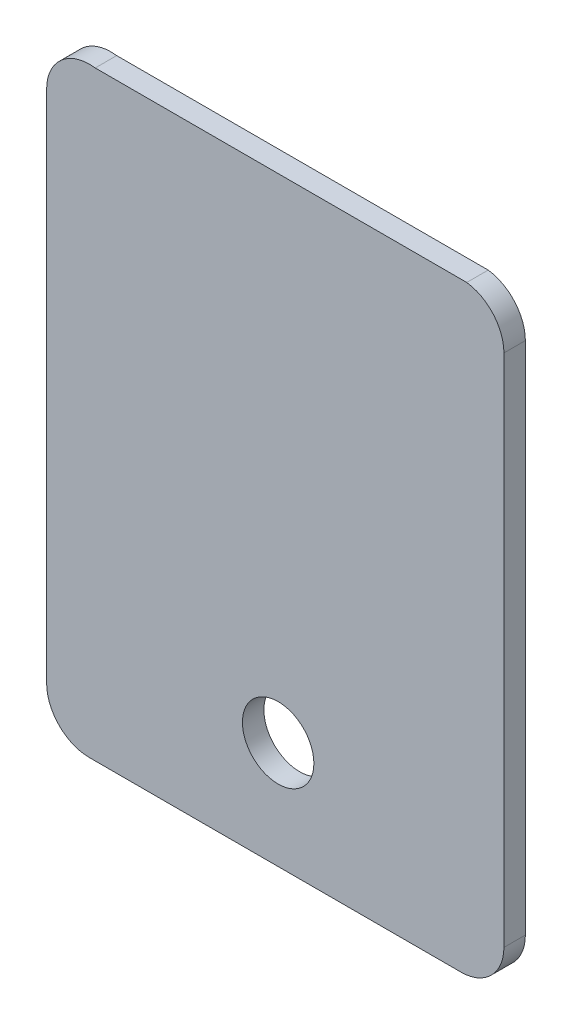
ISO-10303-21;
HEADER;
FILE_DESCRIPTION(('STEP AP214'),'2;1');
FILE_NAME('part.step','',(''),(''),'','','');
FILE_SCHEMA(('AUTOMOTIVE_DESIGN { 1 0 10303 214 1 1 1 1 }'));
ENDSEC;
DATA;
#1=APPLICATION_CONTEXT('core data for automotive mechanical design processes');
#2=APPLICATION_PROTOCOL_DEFINITION('international standard','automotive_design',2000,#1);
#3=PRODUCT_CONTEXT('',#1,'mechanical');
#4=PRODUCT('Part','Part','',(#3));
#5=PRODUCT_RELATED_PRODUCT_CATEGORY('part','',(#4));
#6=PRODUCT_DEFINITION_FORMATION('','',#4);
#7=PRODUCT_DEFINITION_CONTEXT('part definition',#1,'design');
#8=PRODUCT_DEFINITION('design','',#6,#7);
#9=PRODUCT_DEFINITION_SHAPE('','',#8);
#10=(LENGTH_UNIT() NAMED_UNIT(*) SI_UNIT(.MILLI.,.METRE.));
#11=(NAMED_UNIT(*) PLANE_ANGLE_UNIT() SI_UNIT($,.RADIAN.));
#12=(NAMED_UNIT(*) SI_UNIT($,.STERADIAN.) SOLID_ANGLE_UNIT());
#13=UNCERTAINTY_MEASURE_WITH_UNIT(LENGTH_MEASURE(1.E-05),#10,'distance_accuracy_value','');
#14=(GEOMETRIC_REPRESENTATION_CONTEXT(3) GLOBAL_UNCERTAINTY_ASSIGNED_CONTEXT((#13)) GLOBAL_UNIT_ASSIGNED_CONTEXT((#10,
#11,#12)) REPRESENTATION_CONTEXT('',''));
#15=CARTESIAN_POINT('',(0.,0.,0.));
#16=DIRECTION('',(0.,0.,1.));
#17=DIRECTION('',(1.,0.,0.));
#18=AXIS2_PLACEMENT_3D('',#15,#16,#17);
#19=CARTESIAN_POINT('',(-134.546924203489,45.8944488333029,1.5));
#20=DIRECTION('',(0.,0.,-1.));
#21=DIRECTION('',(-1.,0.,0.));
#22=AXIS2_PLACEMENT_3D('',#19,#20,#21);
#23=CYLINDRICAL_SURFACE('',#22,2.99999999999999);
#24=CARTESIAN_POINT('',(-134.546924203489,45.8944488333029,0.));
#25=DIRECTION('',(0.,0.,1.));
#26=DIRECTION('',(-1.,0.,0.));
#27=AXIS2_PLACEMENT_3D('',#24,#25,#26);
#28=CIRCLE('',#27,2.99999999999999);
#29=CARTESIAN_POINT('',(-131.54692420349,45.8944488333029,0.));
#30=VERTEX_POINT('',#29);
#31=CARTESIAN_POINT('',(-134.14692420349,48.8676625827666,0.));
#32=VERTEX_POINT('',#31);
#33=EDGE_CURVE('E129',#30,#32,#28,.T.);
#34=ORIENTED_EDGE('',*,*,#33,.T.);
#35=DIRECTION('',(0.,0.,-1.));
#36=VECTOR('',#35,1.);
#37=CARTESIAN_POINT('',(-134.14692420349,48.8676625827666,1.5));
#38=LINE('',#37,#36);
#39=CARTESIAN_POINT('',(-134.14692420349,48.8676625827666,1.5));
#40=VERTEX_POINT('',#39);
#41=EDGE_CURVE('E11',#40,#32,#38,.T.);
#42=ORIENTED_EDGE('',*,*,#41,.F.);
#43=CARTESIAN_POINT('',(-134.546924203489,45.8944488333029,1.5));
#44=DIRECTION('',(0.,0.,1.));
#45=DIRECTION('',(-1.,0.,0.));
#46=AXIS2_PLACEMENT_3D('',#43,#44,#45);
#47=CIRCLE('',#46,2.99999999999999);
#48=CARTESIAN_POINT('',(-131.54692420349,45.8944488333029,1.5));
#49=VERTEX_POINT('',#48);
#50=EDGE_CURVE('E144',#49,#40,#47,.T.);
#51=ORIENTED_EDGE('',*,*,#50,.F.);
#52=DIRECTION('',(0.,0.,-1.));
#53=VECTOR('',#52,1.);
#54=CARTESIAN_POINT('',(-131.54692420349,45.8944488333029,1.5));
#55=LINE('',#54,#53);
#56=EDGE_CURVE('E125',#49,#30,#55,.T.);
#57=ORIENTED_EDGE('',*,*,#56,.T.);
#58=EDGE_LOOP('',(#34,#42,#51,#57));
#59=FACE_BOUND('',#58,.T.);
#60=ADVANCED_FACE('F33',(#59),#23,.T.);
#61=CARTESIAN_POINT('',(-160.14692420349,48.8676625827666,1.5));
#62=DIRECTION('',(0.,-1.,0.));
#63=DIRECTION('',(0.,0.,-1.));
#64=AXIS2_PLACEMENT_3D('',#61,#62,#63);
#65=PLANE('',#64);
#66=DIRECTION('',(-1.,0.,0.));
#67=VECTOR('',#66,1.);
#68=CARTESIAN_POINT('',(-160.14692420349,48.8676625827666,0.));
#69=LINE('',#68,#67);
#70=CARTESIAN_POINT('',(-160.14692420349,48.8676625827666,0.));
#71=VERTEX_POINT('',#70);
#72=EDGE_CURVE('E132',#32,#71,#69,.T.);
#73=ORIENTED_EDGE('',*,*,#72,.T.);
#74=DIRECTION('',(0.,0.,-1.));
#75=VECTOR('',#74,1.);
#76=CARTESIAN_POINT('',(-160.14692420349,48.8676625827666,1.5));
#77=LINE('',#76,#75);
#78=CARTESIAN_POINT('',(-160.14692420349,48.8676625827666,1.5));
#79=VERTEX_POINT('',#78);
#80=EDGE_CURVE('E41',#79,#71,#77,.T.);
#81=ORIENTED_EDGE('',*,*,#80,.F.);
#82=DIRECTION('',(-1.,0.,0.));
#83=VECTOR('',#82,1.);
#84=CARTESIAN_POINT('',(-160.14692420349,48.8676625827666,1.5));
#85=LINE('',#84,#83);
#86=EDGE_CURVE('E92',#40,#79,#85,.T.);
#87=ORIENTED_EDGE('',*,*,#86,.F.);
#88=ORIENTED_EDGE('',*,*,#41,.T.);
#89=EDGE_LOOP('',(#73,#81,#87,#88));
#90=FACE_BOUND('',#89,.T.);
#91=ADVANCED_FACE('F200',(#90),#65,.F.);
#92=CARTESIAN_POINT('',(-160.546924203489,45.8944488333029,1.5));
#93=DIRECTION('',(0.,0.,-1.));
#94=DIRECTION('',(-1.,0.,0.));
#95=AXIS2_PLACEMENT_3D('',#92,#93,#94);
#96=CYLINDRICAL_SURFACE('',#95,2.99999999999999);
#97=CARTESIAN_POINT('',(-160.546924203489,45.8944488333029,0.));
#98=DIRECTION('',(0.,0.,1.));
#99=DIRECTION('',(1.,0.,0.));
#100=AXIS2_PLACEMENT_3D('',#97,#98,#99);
#101=CIRCLE('',#100,2.99999999999999);
#102=CARTESIAN_POINT('',(-163.546924203489,45.8944488333029,0.));
#103=VERTEX_POINT('',#102);
#104=EDGE_CURVE('E135',#71,#103,#101,.T.);
#105=ORIENTED_EDGE('',*,*,#104,.T.);
#106=DIRECTION('',(0.,0.,-1.));
#107=VECTOR('',#106,1.);
#108=CARTESIAN_POINT('',(-163.546924203489,45.8944488333029,1.5));
#109=LINE('',#108,#107);
#110=CARTESIAN_POINT('',(-163.546924203489,45.8944488333029,1.5));
#111=VERTEX_POINT('',#110);
#112=EDGE_CURVE('E151',#111,#103,#109,.T.);
#113=ORIENTED_EDGE('',*,*,#112,.F.);
#114=CARTESIAN_POINT('',(-160.546924203489,45.8944488333029,1.5));
#115=DIRECTION('',(0.,0.,1.));
#116=DIRECTION('',(1.,0.,0.));
#117=AXIS2_PLACEMENT_3D('',#114,#115,#116);
#118=CIRCLE('',#117,2.99999999999999);
#119=EDGE_CURVE('E159',#79,#111,#118,.T.);
#120=ORIENTED_EDGE('',*,*,#119,.F.);
#121=ORIENTED_EDGE('',*,*,#80,.T.);
#122=EDGE_LOOP('',(#105,#113,#120,#121));
#123=FACE_BOUND('',#122,.T.);
#124=ADVANCED_FACE('F157',(#123),#96,.T.);
#125=CARTESIAN_POINT('',(-163.546924203489,9.8676625827666,1.5));
#126=DIRECTION('',(1.,0.,0.));
#127=DIRECTION('',(0.,1.,0.));
#128=AXIS2_PLACEMENT_3D('',#125,#126,#127);
#129=PLANE('',#128);
#130=DIRECTION('',(0.,-1.,0.));
#131=VECTOR('',#130,1.);
#132=CARTESIAN_POINT('',(-163.546924203489,9.8676625827666,0.));
#133=LINE('',#132,#131);
#134=CARTESIAN_POINT('',(-163.546924203489,9.8676625827666,0.));
#135=VERTEX_POINT('',#134);
#136=EDGE_CURVE('E137',#103,#135,#133,.T.);
#137=ORIENTED_EDGE('',*,*,#136,.T.);
#138=DIRECTION('',(0.,0.,-1.));
#139=VECTOR('',#138,1.);
#140=CARTESIAN_POINT('',(-163.546924203489,9.8676625827666,1.5));
#141=LINE('',#140,#139);
#142=CARTESIAN_POINT('',(-163.546924203489,9.8676625827666,1.5));
#143=VERTEX_POINT('',#142);
#144=EDGE_CURVE('E148',#143,#135,#141,.T.);
#145=ORIENTED_EDGE('',*,*,#144,.F.);
#146=DIRECTION('',(0.,-1.,0.));
#147=VECTOR('',#146,1.);
#148=CARTESIAN_POINT('',(-163.546924203489,9.8676625827666,1.5));
#149=LINE('',#148,#147);
#150=EDGE_CURVE('E171',#111,#143,#149,.T.);
#151=ORIENTED_EDGE('',*,*,#150,.F.);
#152=ORIENTED_EDGE('',*,*,#112,.T.);
#153=EDGE_LOOP('',(#137,#145,#151,#152));
#154=FACE_BOUND('',#153,.T.);
#155=ADVANCED_FACE('F167',(#154),#129,.F.);
#156=CARTESIAN_POINT('',(-160.546924203489,9.8676625827666,1.5));
#157=DIRECTION('',(0.,0.,-1.));
#158=DIRECTION('',(-1.,0.,0.));
#159=AXIS2_PLACEMENT_3D('',#156,#157,#158);
#160=CYLINDRICAL_SURFACE('',#159,3.);
#161=CARTESIAN_POINT('',(-160.546924203489,9.8676625827666,0.));
#162=DIRECTION('',(0.,0.,1.));
#163=DIRECTION('',(-1.,0.,0.));
#164=AXIS2_PLACEMENT_3D('',#161,#162,#163);
#165=CIRCLE('',#164,3.);
#166=CARTESIAN_POINT('',(-160.546924203489,6.8676625827666,0.));
#167=VERTEX_POINT('',#166);
#168=EDGE_CURVE('E139',#135,#167,#165,.T.);
#169=ORIENTED_EDGE('',*,*,#168,.T.);
#170=DIRECTION('',(0.,0.,-1.));
#171=VECTOR('',#170,1.);
#172=CARTESIAN_POINT('',(-160.546924203489,6.8676625827666,1.5));
#173=LINE('',#172,#171);
#174=CARTESIAN_POINT('',(-160.546924203489,6.8676625827666,1.5));
#175=VERTEX_POINT('',#174);
#176=EDGE_CURVE('E120',#175,#167,#173,.T.);
#177=ORIENTED_EDGE('',*,*,#176,.F.);
#178=CARTESIAN_POINT('',(-160.546924203489,9.8676625827666,1.5));
#179=DIRECTION('',(0.,0.,1.));
#180=DIRECTION('',(-1.,0.,0.));
#181=AXIS2_PLACEMENT_3D('',#178,#179,#180);
#182=CIRCLE('',#181,3.);
#183=EDGE_CURVE('E111',#143,#175,#182,.T.);
#184=ORIENTED_EDGE('',*,*,#183,.F.);
#185=ORIENTED_EDGE('',*,*,#144,.T.);
#186=EDGE_LOOP('',(#169,#177,#184,#185));
#187=FACE_BOUND('',#186,.T.);
#188=ADVANCED_FACE('F170',(#187),#160,.T.);
#189=CARTESIAN_POINT('',(-160.546924203489,6.8676625827666,1.5));
#190=DIRECTION('',(0.,1.,0.));
#191=DIRECTION('',(0.,0.,1.));
#192=AXIS2_PLACEMENT_3D('',#189,#190,#191);
#193=PLANE('',#192);
#194=DIRECTION('',(1.,0.,0.));
#195=VECTOR('',#194,1.);
#196=CARTESIAN_POINT('',(-160.546924203489,6.8676625827666,0.));
#197=LINE('',#196,#195);
#198=CARTESIAN_POINT('',(-134.546924203489,6.8676625827666,0.));
#199=VERTEX_POINT('',#198);
#200=EDGE_CURVE('E119',#167,#199,#197,.T.);
#201=ORIENTED_EDGE('',*,*,#200,.T.);
#202=DIRECTION('',(0.,0.,-1.));
#203=VECTOR('',#202,1.);
#204=CARTESIAN_POINT('',(-134.546924203489,6.8676625827666,1.5));
#205=LINE('',#204,#203);
#206=CARTESIAN_POINT('',(-134.546924203489,6.8676625827666,1.5));
#207=VERTEX_POINT('',#206);
#208=EDGE_CURVE('E116',#207,#199,#205,.T.);
#209=ORIENTED_EDGE('',*,*,#208,.F.);
#210=DIRECTION('',(1.,0.,0.));
#211=VECTOR('',#210,1.);
#212=CARTESIAN_POINT('',(-160.546924203489,6.8676625827666,1.5));
#213=LINE('',#212,#211);
#214=EDGE_CURVE('E105',#175,#207,#213,.T.);
#215=ORIENTED_EDGE('',*,*,#214,.F.);
#216=ORIENTED_EDGE('',*,*,#176,.T.);
#217=EDGE_LOOP('',(#201,#209,#215,#216));
#218=FACE_BOUND('',#217,.T.);
#219=ADVANCED_FACE('F117',(#218),#193,.F.);
#220=CARTESIAN_POINT('',(-134.546924203489,9.8676625827666,1.5));
#221=DIRECTION('',(0.,0.,-1.));
#222=DIRECTION('',(-1.,0.,0.));
#223=AXIS2_PLACEMENT_3D('',#220,#221,#222);
#224=CYLINDRICAL_SURFACE('',#223,3.00000000000001);
#225=CARTESIAN_POINT('',(-134.546924203489,9.8676625827666,0.));
#226=DIRECTION('',(0.,0.,1.));
#227=DIRECTION('',(1.,0.,0.));
#228=AXIS2_PLACEMENT_3D('',#225,#226,#227);
#229=CIRCLE('',#228,3.00000000000001);
#230=CARTESIAN_POINT('',(-131.546924203489,9.8676625827666,0.));
#231=VERTEX_POINT('',#230);
#232=EDGE_CURVE('E78',#199,#231,#229,.T.);
#233=ORIENTED_EDGE('',*,*,#232,.T.);
#234=DIRECTION('',(0.,0.,-1.));
#235=VECTOR('',#234,1.);
#236=CARTESIAN_POINT('',(-131.546924203489,9.8676625827666,1.5));
#237=LINE('',#236,#235);
#238=CARTESIAN_POINT('',(-131.546924203489,9.8676625827666,1.5));
#239=VERTEX_POINT('',#238);
#240=EDGE_CURVE('E121',#239,#231,#237,.T.);
#241=ORIENTED_EDGE('',*,*,#240,.F.);
#242=CARTESIAN_POINT('',(-134.546924203489,9.8676625827666,1.5));
#243=DIRECTION('',(0.,0.,1.));
#244=DIRECTION('',(1.,0.,0.));
#245=AXIS2_PLACEMENT_3D('',#242,#243,#244);
#246=CIRCLE('',#245,3.00000000000001);
#247=EDGE_CURVE('E109',#207,#239,#246,.T.);
#248=ORIENTED_EDGE('',*,*,#247,.F.);
#249=ORIENTED_EDGE('',*,*,#208,.T.);
#250=EDGE_LOOP('',(#233,#241,#248,#249));
#251=FACE_BOUND('',#250,.T.);
#252=ADVANCED_FACE('F123',(#251),#224,.T.);
#253=CARTESIAN_POINT('',(-131.546924203489,9.8676625827666,1.5));
#254=DIRECTION('',(-1.,0.,0.));
#255=DIRECTION('',(0.,-1.,0.));
#256=AXIS2_PLACEMENT_3D('',#253,#254,#255);
#257=PLANE('',#256);
#258=DIRECTION('',(0.,1.,0.));
#259=VECTOR('',#258,1.);
#260=CARTESIAN_POINT('',(-131.546924203489,9.8676625827666,0.));
#261=LINE('',#260,#259);
#262=EDGE_CURVE('E84',#231,#30,#261,.T.);
#263=ORIENTED_EDGE('',*,*,#262,.T.);
#264=ORIENTED_EDGE('',*,*,#56,.F.);
#265=DIRECTION('',(0.,1.,0.));
#266=VECTOR('',#265,1.);
#267=CARTESIAN_POINT('',(-131.546924203489,9.8676625827666,1.5));
#268=LINE('',#267,#266);
#269=EDGE_CURVE('E49',#239,#49,#268,.T.);
#270=ORIENTED_EDGE('',*,*,#269,.F.);
#271=ORIENTED_EDGE('',*,*,#240,.T.);
#272=EDGE_LOOP('',(#263,#264,#270,#271));
#273=FACE_BOUND('',#272,.T.);
#274=ADVANCED_FACE('F191',(#273),#257,.F.);
#275=CARTESIAN_POINT('',(-134.546924203489,45.8944488333029,1.5));
#276=DIRECTION('',(0.,0.,-1.));
#277=DIRECTION('',(-1.,0.,0.));
#278=AXIS2_PLACEMENT_3D('',#275,#276,#277);
#279=PLANE('',#278);
#280=CARTESIAN_POINT('',(-147.34692420349,14.3676625827666,1.5));
#281=DIRECTION('',(0.,0.,1.));
#282=DIRECTION('',(1.,0.,0.));
#283=AXIS2_PLACEMENT_3D('',#280,#281,#282);
#284=CIRCLE('',#283,2.5);
#285=CARTESIAN_POINT('',(-144.84692420349,14.3676625827666,1.5));
#286=VERTEX_POINT('',#285);
#287=EDGE_CURVE('E177',#286,#286,#284,.T.);
#288=ORIENTED_EDGE('',*,*,#287,.F.);
#289=EDGE_LOOP('',(#288));
#290=FACE_BOUND('',#289,.T.);
#291=ORIENTED_EDGE('',*,*,#50,.T.);
#292=ORIENTED_EDGE('',*,*,#86,.T.);
#293=ORIENTED_EDGE('',*,*,#119,.T.);
#294=ORIENTED_EDGE('',*,*,#150,.T.);
#295=ORIENTED_EDGE('',*,*,#183,.T.);
#296=ORIENTED_EDGE('',*,*,#214,.T.);
#297=ORIENTED_EDGE('',*,*,#247,.T.);
#298=ORIENTED_EDGE('',*,*,#269,.T.);
#299=EDGE_LOOP('',(#291,#292,#293,#294,#295,#296,#297,#298));
#300=FACE_BOUND('',#299,.T.);
#301=ADVANCED_FACE('F107',(#290,#300),#279,.F.);
#302=CARTESIAN_POINT('',(-134.546924203489,45.8944488333029,0.));
#303=DIRECTION('',(0.,0.,-1.));
#304=DIRECTION('',(-1.,0.,0.));
#305=AXIS2_PLACEMENT_3D('',#302,#303,#304);
#306=PLANE('',#305);
#307=CARTESIAN_POINT('',(-147.34692420349,14.3676625827666,0.));
#308=DIRECTION('',(0.,0.,1.));
#309=DIRECTION('',(1.,0.,0.));
#310=AXIS2_PLACEMENT_3D('',#307,#308,#309);
#311=CIRCLE('',#310,2.5);
#312=CARTESIAN_POINT('',(-144.84692420349,14.3676625827666,0.));
#313=VERTEX_POINT('',#312);
#314=EDGE_CURVE('E133',#313,#313,#311,.T.);
#315=ORIENTED_EDGE('',*,*,#314,.T.);
#316=EDGE_LOOP('',(#315));
#317=FACE_BOUND('',#316,.T.);
#318=ORIENTED_EDGE('',*,*,#33,.F.);
#319=ORIENTED_EDGE('',*,*,#262,.F.);
#320=ORIENTED_EDGE('',*,*,#232,.F.);
#321=ORIENTED_EDGE('',*,*,#200,.F.);
#322=ORIENTED_EDGE('',*,*,#168,.F.);
#323=ORIENTED_EDGE('',*,*,#136,.F.);
#324=ORIENTED_EDGE('',*,*,#104,.F.);
#325=ORIENTED_EDGE('',*,*,#72,.F.);
#326=EDGE_LOOP('',(#318,#319,#320,#321,#322,#323,#324,#325));
#327=FACE_BOUND('',#326,.T.);
#328=ADVANCED_FACE('F163',(#317,#327),#306,.T.);
#329=CARTESIAN_POINT('',(-147.34692420349,14.3676625827666,0.));
#330=DIRECTION('',(0.,0.,1.));
#331=DIRECTION('',(1.,0.,0.));
#332=AXIS2_PLACEMENT_3D('',#329,#330,#331);
#333=CYLINDRICAL_SURFACE('',#332,2.5);
#334=ORIENTED_EDGE('',*,*,#314,.F.);
#335=EDGE_LOOP('',(#334));
#336=FACE_BOUND('',#335,.T.);
#337=ORIENTED_EDGE('',*,*,#287,.T.);
#338=EDGE_LOOP('',(#337));
#339=FACE_BOUND('',#338,.T.);
#340=ADVANCED_FACE('F184',(#336,#339),#333,.F.);
#341=CLOSED_SHELL('',(#60,#91,#124,#155,#188,#219,#252,#274,#301,#328,#340));
#342=MANIFOLD_SOLID_BREP('B2',#341);
#343=ADVANCED_BREP_SHAPE_REPRESENTATION('',(#18,#342),#14);
#344=SHAPE_DEFINITION_REPRESENTATION(#9,#343);
ENDSEC;
END-ISO-10303-21;
